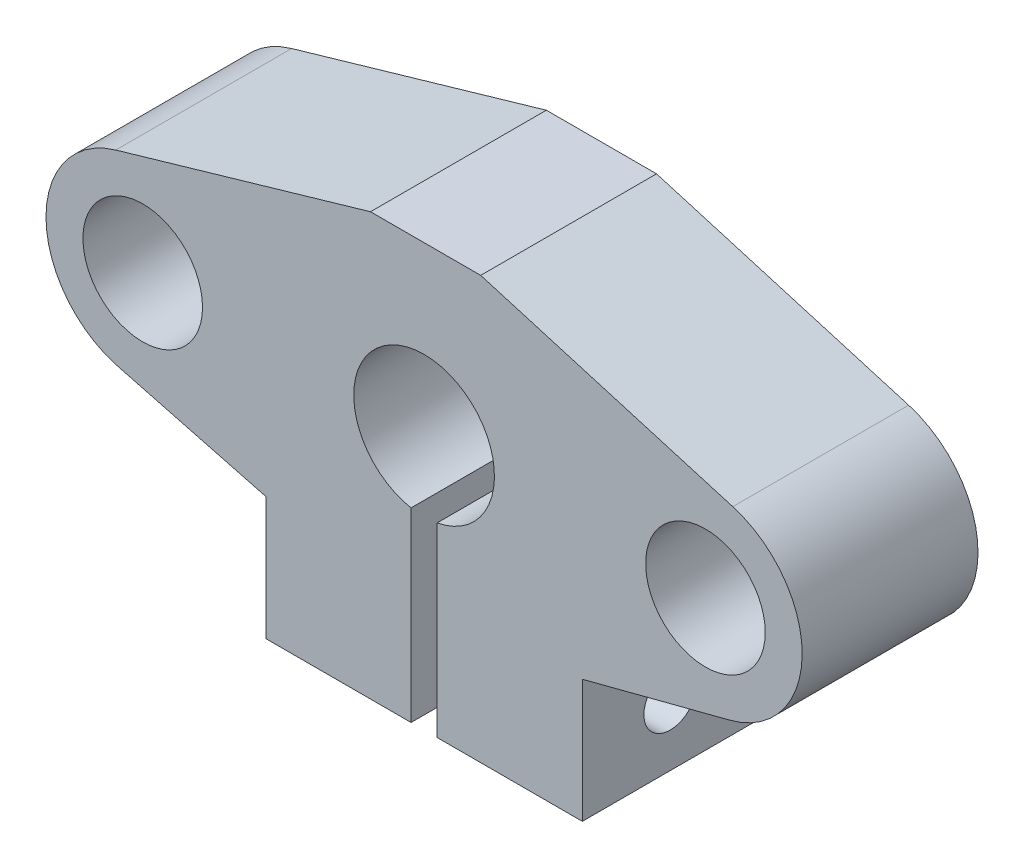
ISO-10303-21;
HEADER;
FILE_DESCRIPTION(('STEP AP214'),'2;1');
FILE_NAME('part.step','',(''),(''),'','','');
FILE_SCHEMA(('AUTOMOTIVE_DESIGN { 1 0 10303 214 1 1 1 1 }'));
ENDSEC;
DATA;
#1=APPLICATION_CONTEXT('core data for automotive mechanical design processes');
#2=APPLICATION_PROTOCOL_DEFINITION('international standard','automotive_design',2000,#1);
#3=PRODUCT_CONTEXT('',#1,'mechanical');
#4=PRODUCT('Part','Part','',(#3));
#5=PRODUCT_RELATED_PRODUCT_CATEGORY('part','',(#4));
#6=PRODUCT_DEFINITION_FORMATION('','',#4);
#7=PRODUCT_DEFINITION_CONTEXT('part definition',#1,'design');
#8=PRODUCT_DEFINITION('design','',#6,#7);
#9=PRODUCT_DEFINITION_SHAPE('','',#8);
#10=(LENGTH_UNIT() NAMED_UNIT(*) SI_UNIT(.MILLI.,.METRE.));
#11=(NAMED_UNIT(*) PLANE_ANGLE_UNIT() SI_UNIT($,.RADIAN.));
#12=(NAMED_UNIT(*) SI_UNIT($,.STERADIAN.) SOLID_ANGLE_UNIT());
#13=UNCERTAINTY_MEASURE_WITH_UNIT(LENGTH_MEASURE(1.E-05),#10,'distance_accuracy_value','');
#14=(GEOMETRIC_REPRESENTATION_CONTEXT(3) GLOBAL_UNCERTAINTY_ASSIGNED_CONTEXT((#13)) GLOBAL_UNIT_ASSIGNED_CONTEXT((#10,
#11,#12)) REPRESENTATION_CONTEXT('',''));
#15=CARTESIAN_POINT('',(0.,0.,0.));
#16=DIRECTION('',(0.,0.,1.));
#17=DIRECTION('',(1.,0.,0.));
#18=AXIS2_PLACEMENT_3D('',#15,#16,#17);
#19=CARTESIAN_POINT('',(0.,0.,10.));
#20=DIRECTION('',(0.,0.,1.));
#21=DIRECTION('',(1.,0.,0.));
#22=AXIS2_PLACEMENT_3D('',#19,#20,#21);
#23=PLANE('',#22);
#24=CARTESIAN_POINT('',(-15.9999942904647,0.0135168449332014,10.));
#25=DIRECTION('',(0.,0.,1.));
#26=DIRECTION('',(1.,0.,0.));
#27=AXIS2_PLACEMENT_3D('',#24,#25,#26);
#28=CIRCLE('',#27,3.4);
#29=CARTESIAN_POINT('',(-12.5999942904647,0.0135168449332014,10.));
#30=VERTEX_POINT('',#29);
#31=EDGE_CURVE('E172',#30,#30,#28,.T.);
#32=ORIENTED_EDGE('',*,*,#31,.F.);
#33=EDGE_LOOP('',(#32));
#34=FACE_BOUND('',#33,.T.);
#35=CARTESIAN_POINT('',(0.,0.,10.));
#36=DIRECTION('',(0.,0.,-1.));
#37=DIRECTION('',(1.,0.,0.));
#38=AXIS2_PLACEMENT_3D('',#35,#36,#37);
#39=CIRCLE('',#38,4.);
#40=CARTESIAN_POINT('',(-0.740403032800426,-3.93087819055996,10.));
#41=VERTEX_POINT('',#40);
#42=CARTESIAN_POINT('',(0.74040303280043,-3.93087819055996,10.));
#43=VERTEX_POINT('',#42);
#44=EDGE_CURVE('E195',#41,#43,#39,.T.);
#45=ORIENTED_EDGE('',*,*,#44,.T.);
#46=DIRECTION('',(0.,-1.,0.));
#47=VECTOR('',#46,1.);
#48=CARTESIAN_POINT('',(0.74040303280043,-14.5,10.));
#49=LINE('',#48,#47);
#50=CARTESIAN_POINT('',(0.74040303280043,-14.5,10.));
#51=VERTEX_POINT('',#50);
#52=EDGE_CURVE('E113',#43,#51,#49,.T.);
#53=ORIENTED_EDGE('',*,*,#52,.T.);
#54=DIRECTION('',(1.,0.,0.));
#55=VECTOR('',#54,1.);
#56=CARTESIAN_POINT('',(0.74040303280043,-14.5,10.));
#57=LINE('',#56,#55);
#58=CARTESIAN_POINT('',(9.,-14.5,10.));
#59=VERTEX_POINT('',#58);
#60=EDGE_CURVE('E229',#51,#59,#57,.T.);
#61=ORIENTED_EDGE('',*,*,#60,.T.);
#62=DIRECTION('',(0.,1.,0.));
#63=VECTOR('',#62,1.);
#64=CARTESIAN_POINT('',(8.99999999999999,-7.5,10.));
#65=LINE('',#64,#63);
#66=CARTESIAN_POINT('',(8.99999999999999,-7.5,10.));
#67=VERTEX_POINT('',#66);
#68=EDGE_CURVE('E248',#59,#67,#65,.T.);
#69=ORIENTED_EDGE('',*,*,#68,.T.);
#70=DIRECTION('',(0.967891878530005,0.251366886195574,0.));
#71=VECTOR('',#70,1.);
#72=CARTESIAN_POINT('',(8.99999999999999,-7.5,10.));
#73=LINE('',#72,#71);
#74=CARTESIAN_POINT('',(17.3824225772709,-5.32303839017206,10.));
#75=VERTEX_POINT('',#74);
#76=EDGE_CURVE('E245',#67,#75,#73,.T.);
#77=ORIENTED_EDGE('',*,*,#76,.T.);
#78=CARTESIAN_POINT('',(16.,0.,10.));
#79=DIRECTION('',(0.,0.,1.));
#80=DIRECTION('',(1.,0.,0.));
#81=AXIS2_PLACEMENT_3D('',#78,#79,#80);
#82=CIRCLE('',#81,5.49962088560602);
#83=CARTESIAN_POINT('',(17.5546840026287,5.27529975805777,10.));
#84=VERTEX_POINT('',#83);
#85=EDGE_CURVE('E247',#75,#84,#82,.T.);
#86=ORIENTED_EDGE('',*,*,#85,.T.);
#87=DIRECTION('',(-0.959211528900954,0.282689304402366,0.));
#88=VECTOR('',#87,1.);
#89=CARTESIAN_POINT('',(3.2195778804187,9.5,10.));
#90=LINE('',#89,#88);
#91=CARTESIAN_POINT('',(3.2195778804187,9.5,10.));
#92=VERTEX_POINT('',#91);
#93=EDGE_CURVE('E250',#84,#92,#90,.T.);
#94=ORIENTED_EDGE('',*,*,#93,.T.);
#95=DIRECTION('',(-1.,0.,0.));
#96=VECTOR('',#95,1.);
#97=CARTESIAN_POINT('',(-3.04677229171448,9.5,10.));
#98=LINE('',#97,#96);
#99=CARTESIAN_POINT('',(-3.04677229171448,9.5,10.));
#100=VERTEX_POINT('',#99);
#101=EDGE_CURVE('E256',#92,#100,#98,.T.);
#102=ORIENTED_EDGE('',*,*,#101,.T.);
#103=DIRECTION('',(-0.960368072137898,-0.27873493863909,0.));
#104=VECTOR('',#103,1.);
#105=CARTESIAN_POINT('',(-3.04677229171448,9.5,10.));
#106=LINE('',#105,#104);
#107=CARTESIAN_POINT('',(-17.5330364529797,5.29554124169164,10.));
#108=VERTEX_POINT('',#107);
#109=EDGE_CURVE('E258',#100,#108,#106,.T.);
#110=ORIENTED_EDGE('',*,*,#109,.T.);
#111=CARTESIAN_POINT('',(-15.9999942904647,0.0135168449332014,10.));
#112=DIRECTION('',(0.,0.,1.));
#113=DIRECTION('',(1.,0.,0.));
#114=AXIS2_PLACEMENT_3D('',#111,#112,#113);
#115=CIRCLE('',#114,5.5);
#116=CARTESIAN_POINT('',(-17.5974469522091,-5.2493858706303,10.));
#117=VERTEX_POINT('',#116);
#118=EDGE_CURVE('E260',#108,#117,#115,.T.);
#119=ORIENTED_EDGE('',*,*,#118,.T.);
#120=DIRECTION('',(0.967402502123384,-0.253243753892204,0.));
#121=VECTOR('',#120,1.);
#122=CARTESIAN_POINT('',(-9.00000000000001,-7.50000000000004,10.));
#123=LINE('',#122,#121);
#124=CARTESIAN_POINT('',(-9.00000000000001,-7.50000000000004,10.));
#125=VERTEX_POINT('',#124);
#126=EDGE_CURVE('E150',#117,#125,#123,.T.);
#127=ORIENTED_EDGE('',*,*,#126,.T.);
#128=DIRECTION('',(0.,-1.,0.));
#129=VECTOR('',#128,1.);
#130=CARTESIAN_POINT('',(-9.00000000000001,-7.50000000000004,10.));
#131=LINE('',#130,#129);
#132=CARTESIAN_POINT('',(-9.00000000000001,-14.5,10.));
#133=VERTEX_POINT('',#132);
#134=EDGE_CURVE('E144',#125,#133,#131,.T.);
#135=ORIENTED_EDGE('',*,*,#134,.T.);
#136=DIRECTION('',(1.,0.,0.));
#137=VECTOR('',#136,1.);
#138=CARTESIAN_POINT('',(-9.00000000000001,-14.5,10.));
#139=LINE('',#138,#137);
#140=CARTESIAN_POINT('',(-0.740403032800426,-14.5,10.));
#141=VERTEX_POINT('',#140);
#142=EDGE_CURVE('E148',#133,#141,#139,.T.);
#143=ORIENTED_EDGE('',*,*,#142,.T.);
#144=DIRECTION('',(0.,1.,0.));
#145=VECTOR('',#144,1.);
#146=CARTESIAN_POINT('',(-0.740403032800426,-14.5,10.));
#147=LINE('',#146,#145);
#148=EDGE_CURVE('E52',#141,#41,#147,.T.);
#149=ORIENTED_EDGE('',*,*,#148,.T.);
#150=EDGE_LOOP('',(#45,#53,#61,#69,#77,#86,#94,#102,#110,#119,#127,#135,#143,#149));
#151=FACE_BOUND('',#150,.T.);
#152=CARTESIAN_POINT('',(16.,0.,10.));
#153=DIRECTION('',(0.,0.,1.));
#154=DIRECTION('',(1.,0.,0.));
#155=AXIS2_PLACEMENT_3D('',#152,#153,#154);
#156=CIRCLE('',#155,3.4);
#157=CARTESIAN_POINT('',(19.4,0.,10.));
#158=VERTEX_POINT('',#157);
#159=EDGE_CURVE('E319',#158,#158,#156,.T.);
#160=ORIENTED_EDGE('',*,*,#159,.F.);
#161=EDGE_LOOP('',(#160));
#162=FACE_BOUND('',#161,.T.);
#163=ADVANCED_FACE('F34',(#34,#151,#162),#23,.T.);
#164=CARTESIAN_POINT('',(0.,0.,0.));
#165=DIRECTION('',(0.,0.,1.));
#166=DIRECTION('',(1.,0.,0.));
#167=AXIS2_PLACEMENT_3D('',#164,#165,#166);
#168=PLANE('',#167);
#169=CARTESIAN_POINT('',(0.,0.,0.));
#170=DIRECTION('',(0.,0.,-1.));
#171=DIRECTION('',(1.,0.,0.));
#172=AXIS2_PLACEMENT_3D('',#169,#170,#171);
#173=CIRCLE('',#172,4.);
#174=CARTESIAN_POINT('',(-0.740403032800426,-3.93087819055996,0.));
#175=VERTEX_POINT('',#174);
#176=CARTESIAN_POINT('',(0.74040303280043,-3.93087819055996,0.));
#177=VERTEX_POINT('',#176);
#178=EDGE_CURVE('E168',#175,#177,#173,.T.);
#179=ORIENTED_EDGE('',*,*,#178,.F.);
#180=DIRECTION('',(0.,1.,0.));
#181=VECTOR('',#180,1.);
#182=CARTESIAN_POINT('',(-0.740403032800426,-14.5,0.));
#183=LINE('',#182,#181);
#184=CARTESIAN_POINT('',(-0.740403032800426,-14.5,0.));
#185=VERTEX_POINT('',#184);
#186=EDGE_CURVE('E105',#185,#175,#183,.T.);
#187=ORIENTED_EDGE('',*,*,#186,.F.);
#188=DIRECTION('',(1.,0.,0.));
#189=VECTOR('',#188,1.);
#190=CARTESIAN_POINT('',(-9.00000000000001,-14.5,0.));
#191=LINE('',#190,#189);
#192=CARTESIAN_POINT('',(-9.00000000000001,-14.5,0.));
#193=VERTEX_POINT('',#192);
#194=EDGE_CURVE('E99',#193,#185,#191,.T.);
#195=ORIENTED_EDGE('',*,*,#194,.F.);
#196=DIRECTION('',(0.,-1.,0.));
#197=VECTOR('',#196,1.);
#198=CARTESIAN_POINT('',(-9.00000000000001,-7.50000000000004,0.));
#199=LINE('',#198,#197);
#200=CARTESIAN_POINT('',(-9.00000000000001,-7.50000000000004,0.));
#201=VERTEX_POINT('',#200);
#202=EDGE_CURVE('E158',#201,#193,#199,.T.);
#203=ORIENTED_EDGE('',*,*,#202,.F.);
#204=DIRECTION('',(0.967402502123384,-0.253243753892204,0.));
#205=VECTOR('',#204,1.);
#206=CARTESIAN_POINT('',(-9.00000000000001,-7.50000000000004,0.));
#207=LINE('',#206,#205);
#208=CARTESIAN_POINT('',(-17.5974469522091,-5.2493858706303,0.));
#209=VERTEX_POINT('',#208);
#210=EDGE_CURVE('E190',#209,#201,#207,.T.);
#211=ORIENTED_EDGE('',*,*,#210,.F.);
#212=CARTESIAN_POINT('',(-15.9999942904647,0.0135168449332014,0.));
#213=DIRECTION('',(0.,0.,1.));
#214=DIRECTION('',(1.,0.,0.));
#215=AXIS2_PLACEMENT_3D('',#212,#213,#214);
#216=CIRCLE('',#215,5.5);
#217=CARTESIAN_POINT('',(-17.5330364529797,5.29554124169164,0.));
#218=VERTEX_POINT('',#217);
#219=EDGE_CURVE('E188',#218,#209,#216,.T.);
#220=ORIENTED_EDGE('',*,*,#219,.F.);
#221=DIRECTION('',(-0.960368072137898,-0.27873493863909,0.));
#222=VECTOR('',#221,1.);
#223=CARTESIAN_POINT('',(-3.04677229171448,9.5,0.));
#224=LINE('',#223,#222);
#225=CARTESIAN_POINT('',(-3.04677229171448,9.5,0.));
#226=VERTEX_POINT('',#225);
#227=EDGE_CURVE('E186',#226,#218,#224,.T.);
#228=ORIENTED_EDGE('',*,*,#227,.F.);
#229=DIRECTION('',(-1.,0.,0.));
#230=VECTOR('',#229,1.);
#231=CARTESIAN_POINT('',(-3.04677229171448,9.5,0.));
#232=LINE('',#231,#230);
#233=CARTESIAN_POINT('',(3.2195778804187,9.5,0.));
#234=VERTEX_POINT('',#233);
#235=EDGE_CURVE('E184',#234,#226,#232,.T.);
#236=ORIENTED_EDGE('',*,*,#235,.F.);
#237=DIRECTION('',(-0.959211528900954,0.282689304402366,0.));
#238=VECTOR('',#237,1.);
#239=CARTESIAN_POINT('',(3.2195778804187,9.5,0.));
#240=LINE('',#239,#238);
#241=CARTESIAN_POINT('',(17.5546840026287,5.27529975805777,0.));
#242=VERTEX_POINT('',#241);
#243=EDGE_CURVE('E182',#242,#234,#240,.T.);
#244=ORIENTED_EDGE('',*,*,#243,.F.);
#245=CARTESIAN_POINT('',(16.,0.,0.));
#246=DIRECTION('',(0.,0.,1.));
#247=DIRECTION('',(1.,0.,0.));
#248=AXIS2_PLACEMENT_3D('',#245,#246,#247);
#249=CIRCLE('',#248,5.49962088560602);
#250=CARTESIAN_POINT('',(17.3824225772709,-5.32303839017206,0.));
#251=VERTEX_POINT('',#250);
#252=EDGE_CURVE('E180',#251,#242,#249,.T.);
#253=ORIENTED_EDGE('',*,*,#252,.F.);
#254=DIRECTION('',(0.967891878530005,0.251366886195574,0.));
#255=VECTOR('',#254,1.);
#256=CARTESIAN_POINT('',(8.99999999999999,-7.5,0.));
#257=LINE('',#256,#255);
#258=CARTESIAN_POINT('',(8.99999999999999,-7.5,0.));
#259=VERTEX_POINT('',#258);
#260=EDGE_CURVE('E178',#259,#251,#257,.T.);
#261=ORIENTED_EDGE('',*,*,#260,.F.);
#262=DIRECTION('',(0.,1.,0.));
#263=VECTOR('',#262,1.);
#264=CARTESIAN_POINT('',(8.99999999999999,-7.5,0.));
#265=LINE('',#264,#263);
#266=CARTESIAN_POINT('',(9.,-14.5,0.));
#267=VERTEX_POINT('',#266);
#268=EDGE_CURVE('E176',#267,#259,#265,.T.);
#269=ORIENTED_EDGE('',*,*,#268,.F.);
#270=DIRECTION('',(1.,0.,0.));
#271=VECTOR('',#270,1.);
#272=CARTESIAN_POINT('',(0.74040303280043,-14.5,0.));
#273=LINE('',#272,#271);
#274=CARTESIAN_POINT('',(0.74040303280043,-14.5,0.));
#275=VERTEX_POINT('',#274);
#276=EDGE_CURVE('E174',#275,#267,#273,.T.);
#277=ORIENTED_EDGE('',*,*,#276,.F.);
#278=DIRECTION('',(0.,-1.,0.));
#279=VECTOR('',#278,1.);
#280=CARTESIAN_POINT('',(0.74040303280043,-14.5,0.));
#281=LINE('',#280,#279);
#282=EDGE_CURVE('E171',#177,#275,#281,.T.);
#283=ORIENTED_EDGE('',*,*,#282,.F.);
#284=EDGE_LOOP('',(#179,#187,#195,#203,#211,#220,#228,#236,#244,#253,#261,#269,#277,#283));
#285=FACE_BOUND('',#284,.T.);
#286=CARTESIAN_POINT('',(-15.9999942904647,0.0135168449332014,0.));
#287=DIRECTION('',(0.,0.,1.));
#288=DIRECTION('',(1.,0.,0.));
#289=AXIS2_PLACEMENT_3D('',#286,#287,#288);
#290=CIRCLE('',#289,3.4);
#291=CARTESIAN_POINT('',(-12.5999942904647,0.0135168449332014,0.));
#292=VERTEX_POINT('',#291);
#293=EDGE_CURVE('E325',#292,#292,#290,.T.);
#294=ORIENTED_EDGE('',*,*,#293,.T.);
#295=EDGE_LOOP('',(#294));
#296=FACE_BOUND('',#295,.T.);
#297=CARTESIAN_POINT('',(16.,0.,0.));
#298=DIRECTION('',(0.,0.,1.));
#299=DIRECTION('',(1.,0.,0.));
#300=AXIS2_PLACEMENT_3D('',#297,#298,#299);
#301=CIRCLE('',#300,3.4);
#302=CARTESIAN_POINT('',(19.4,0.,0.));
#303=VERTEX_POINT('',#302);
#304=EDGE_CURVE('E316',#303,#303,#301,.T.);
#305=ORIENTED_EDGE('',*,*,#304,.T.);
#306=EDGE_LOOP('',(#305));
#307=FACE_BOUND('',#306,.T.);
#308=ADVANCED_FACE('F233',(#285,#296,#307),#168,.F.);
#309=CARTESIAN_POINT('',(0.,0.,10.));
#310=DIRECTION('',(0.,0.,-1.));
#311=DIRECTION('',(-1.,0.,0.));
#312=AXIS2_PLACEMENT_3D('',#309,#310,#311);
#313=CYLINDRICAL_SURFACE('',#312,4.);
#314=ORIENTED_EDGE('',*,*,#178,.T.);
#315=DIRECTION('',(0.,0.,-1.));
#316=VECTOR('',#315,1.);
#317=CARTESIAN_POINT('',(0.74040303280043,-3.93087819055996,10.));
#318=LINE('',#317,#316);
#319=EDGE_CURVE('E11',#43,#177,#318,.T.);
#320=ORIENTED_EDGE('',*,*,#319,.F.);
#321=ORIENTED_EDGE('',*,*,#44,.F.);
#322=DIRECTION('',(0.,0.,-1.));
#323=VECTOR('',#322,1.);
#324=CARTESIAN_POINT('',(-0.740403032800426,-3.93087819055996,10.));
#325=LINE('',#324,#323);
#326=EDGE_CURVE('E164',#41,#175,#325,.T.);
#327=ORIENTED_EDGE('',*,*,#326,.T.);
#328=EDGE_LOOP('',(#314,#320,#321,#327));
#329=FACE_BOUND('',#328,.T.);
#330=ADVANCED_FACE('F36',(#329),#313,.F.);
#331=CARTESIAN_POINT('',(0.74040303280043,-14.5,10.));
#332=DIRECTION('',(1.,0.,0.));
#333=DIRECTION('',(0.,0.,-1.));
#334=AXIS2_PLACEMENT_3D('',#331,#332,#333);
#335=PLANE('',#334);
#336=CARTESIAN_POINT('',(0.74040303280043,-11.,5.));
#337=DIRECTION('',(1.,0.,0.));
#338=DIRECTION('',(0.,0.,-1.));
#339=AXIS2_PLACEMENT_3D('',#336,#337,#338);
#340=CIRCLE('',#339,1.5);
#341=CARTESIAN_POINT('',(0.74040303280043,-11.,3.5));
#342=VERTEX_POINT('',#341);
#343=EDGE_CURVE('E314',#342,#342,#340,.T.);
#344=ORIENTED_EDGE('',*,*,#343,.T.);
#345=EDGE_LOOP('',(#344));
#346=FACE_BOUND('',#345,.T.);
#347=ORIENTED_EDGE('',*,*,#282,.T.);
#348=DIRECTION('',(0.,0.,-1.));
#349=VECTOR('',#348,1.);
#350=CARTESIAN_POINT('',(0.74040303280043,-14.5,10.));
#351=LINE('',#350,#349);
#352=EDGE_CURVE('E44',#51,#275,#351,.T.);
#353=ORIENTED_EDGE('',*,*,#352,.F.);
#354=ORIENTED_EDGE('',*,*,#52,.F.);
#355=ORIENTED_EDGE('',*,*,#319,.T.);
#356=EDGE_LOOP('',(#347,#353,#354,#355));
#357=FACE_BOUND('',#356,.T.);
#358=ADVANCED_FACE('F375',(#346,#357),#335,.F.);
#359=CARTESIAN_POINT('',(0.74040303280043,-14.5,10.));
#360=DIRECTION('',(0.,1.,0.));
#361=DIRECTION('',(0.,0.,1.));
#362=AXIS2_PLACEMENT_3D('',#359,#360,#361);
#363=PLANE('',#362);
#364=ORIENTED_EDGE('',*,*,#276,.T.);
#365=DIRECTION('',(0.,0.,-1.));
#366=VECTOR('',#365,1.);
#367=CARTESIAN_POINT('',(9.,-14.5,10.));
#368=LINE('',#367,#366);
#369=EDGE_CURVE('E220',#59,#267,#368,.T.);
#370=ORIENTED_EDGE('',*,*,#369,.F.);
#371=ORIENTED_EDGE('',*,*,#60,.F.);
#372=ORIENTED_EDGE('',*,*,#352,.T.);
#373=EDGE_LOOP('',(#364,#370,#371,#372));
#374=FACE_BOUND('',#373,.T.);
#375=ADVANCED_FACE('F227',(#374),#363,.F.);
#376=CARTESIAN_POINT('',(8.99999999999999,-7.5,10.));
#377=DIRECTION('',(-1.,0.,0.));
#378=DIRECTION('',(0.,-1.,0.));
#379=AXIS2_PLACEMENT_3D('',#376,#377,#378);
#380=PLANE('',#379);
#381=CARTESIAN_POINT('',(9.,-11.,5.));
#382=DIRECTION('',(-1.,0.,0.));
#383=DIRECTION('',(0.,-1.,0.));
#384=AXIS2_PLACEMENT_3D('',#381,#382,#383);
#385=CIRCLE('',#384,1.5);
#386=CARTESIAN_POINT('',(9.,-12.5,5.));
#387=VERTEX_POINT('',#386);
#388=EDGE_CURVE('E311',#387,#387,#385,.T.);
#389=ORIENTED_EDGE('',*,*,#388,.T.);
#390=EDGE_LOOP('',(#389));
#391=FACE_BOUND('',#390,.T.);
#392=ORIENTED_EDGE('',*,*,#268,.T.);
#393=DIRECTION('',(0.,0.,-1.));
#394=VECTOR('',#393,1.);
#395=CARTESIAN_POINT('',(8.99999999999999,-7.5,10.));
#396=LINE('',#395,#394);
#397=EDGE_CURVE('E217',#67,#259,#396,.T.);
#398=ORIENTED_EDGE('',*,*,#397,.F.);
#399=ORIENTED_EDGE('',*,*,#68,.F.);
#400=ORIENTED_EDGE('',*,*,#369,.T.);
#401=EDGE_LOOP('',(#392,#398,#399,#400));
#402=FACE_BOUND('',#401,.T.);
#403=ADVANCED_FACE('F239',(#391,#402),#380,.F.);
#404=CARTESIAN_POINT('',(8.99999999999999,-7.5,10.));
#405=DIRECTION('',(-0.251366886195574,0.967891878530005,0.));
#406=DIRECTION('',(-0.967891878530005,-0.251366886195574,0.));
#407=AXIS2_PLACEMENT_3D('',#404,#405,#406);
#408=PLANE('',#407);
#409=ORIENTED_EDGE('',*,*,#260,.T.);
#410=DIRECTION('',(0.,0.,-1.));
#411=VECTOR('',#410,1.);
#412=CARTESIAN_POINT('',(17.3824225772709,-5.32303839017206,10.));
#413=LINE('',#412,#411);
#414=EDGE_CURVE('E214',#75,#251,#413,.T.);
#415=ORIENTED_EDGE('',*,*,#414,.F.);
#416=ORIENTED_EDGE('',*,*,#76,.F.);
#417=ORIENTED_EDGE('',*,*,#397,.T.);
#418=EDGE_LOOP('',(#409,#415,#416,#417));
#419=FACE_BOUND('',#418,.T.);
#420=ADVANCED_FACE('F243',(#419),#408,.F.);
#421=CARTESIAN_POINT('',(16.,0.,10.));
#422=DIRECTION('',(0.,0.,-1.));
#423=DIRECTION('',(-1.,0.,0.));
#424=AXIS2_PLACEMENT_3D('',#421,#422,#423);
#425=CYLINDRICAL_SURFACE('',#424,5.49962088560602);
#426=ORIENTED_EDGE('',*,*,#252,.T.);
#427=DIRECTION('',(0.,0.,-1.));
#428=VECTOR('',#427,1.);
#429=CARTESIAN_POINT('',(17.5546840026287,5.27529975805777,10.));
#430=LINE('',#429,#428);
#431=EDGE_CURVE('E211',#84,#242,#430,.T.);
#432=ORIENTED_EDGE('',*,*,#431,.F.);
#433=ORIENTED_EDGE('',*,*,#85,.F.);
#434=ORIENTED_EDGE('',*,*,#414,.T.);
#435=EDGE_LOOP('',(#426,#432,#433,#434));
#436=FACE_BOUND('',#435,.T.);
#437=ADVANCED_FACE('F364',(#436),#425,.T.);
#438=CARTESIAN_POINT('',(3.2195778804187,9.5,10.));
#439=DIRECTION('',(-0.282689304402366,-0.959211528900954,0.));
#440=DIRECTION('',(0.959211528900954,-0.282689304402366,0.));
#441=AXIS2_PLACEMENT_3D('',#438,#439,#440);
#442=PLANE('',#441);
#443=ORIENTED_EDGE('',*,*,#243,.T.);
#444=DIRECTION('',(0.,0.,-1.));
#445=VECTOR('',#444,1.);
#446=CARTESIAN_POINT('',(3.2195778804187,9.5,10.));
#447=LINE('',#446,#445);
#448=EDGE_CURVE('E208',#92,#234,#447,.T.);
#449=ORIENTED_EDGE('',*,*,#448,.F.);
#450=ORIENTED_EDGE('',*,*,#93,.F.);
#451=ORIENTED_EDGE('',*,*,#431,.T.);
#452=EDGE_LOOP('',(#443,#449,#450,#451));
#453=FACE_BOUND('',#452,.T.);
#454=ADVANCED_FACE('F360',(#453),#442,.F.);
#455=CARTESIAN_POINT('',(-3.04677229171448,9.5,10.));
#456=DIRECTION('',(0.,-1.,0.));
#457=DIRECTION('',(0.,0.,-1.));
#458=AXIS2_PLACEMENT_3D('',#455,#456,#457);
#459=PLANE('',#458);
#460=ORIENTED_EDGE('',*,*,#235,.T.);
#461=DIRECTION('',(0.,0.,-1.));
#462=VECTOR('',#461,1.);
#463=CARTESIAN_POINT('',(-3.04677229171448,9.5,10.));
#464=LINE('',#463,#462);
#465=EDGE_CURVE('E205',#100,#226,#464,.T.);
#466=ORIENTED_EDGE('',*,*,#465,.F.);
#467=ORIENTED_EDGE('',*,*,#101,.F.);
#468=ORIENTED_EDGE('',*,*,#448,.T.);
#469=EDGE_LOOP('',(#460,#466,#467,#468));
#470=FACE_BOUND('',#469,.T.);
#471=ADVANCED_FACE('F356',(#470),#459,.F.);
#472=CARTESIAN_POINT('',(-3.04677229171448,9.5,10.));
#473=DIRECTION('',(0.27873493863909,-0.960368072137898,0.));
#474=DIRECTION('',(0.960368072137898,0.27873493863909,0.));
#475=AXIS2_PLACEMENT_3D('',#472,#473,#474);
#476=PLANE('',#475);
#477=ORIENTED_EDGE('',*,*,#227,.T.);
#478=DIRECTION('',(0.,0.,-1.));
#479=VECTOR('',#478,1.);
#480=CARTESIAN_POINT('',(-17.5330364529797,5.29554124169164,10.));
#481=LINE('',#480,#479);
#482=EDGE_CURVE('E202',#108,#218,#481,.T.);
#483=ORIENTED_EDGE('',*,*,#482,.F.);
#484=ORIENTED_EDGE('',*,*,#109,.F.);
#485=ORIENTED_EDGE('',*,*,#465,.T.);
#486=EDGE_LOOP('',(#477,#483,#484,#485));
#487=FACE_BOUND('',#486,.T.);
#488=ADVANCED_FACE('F353',(#487),#476,.F.);
#489=CARTESIAN_POINT('',(-15.9999942904647,0.0135168449332014,10.));
#490=DIRECTION('',(0.,0.,-1.));
#491=DIRECTION('',(-1.,0.,0.));
#492=AXIS2_PLACEMENT_3D('',#489,#490,#491);
#493=CYLINDRICAL_SURFACE('',#492,5.5);
#494=ORIENTED_EDGE('',*,*,#219,.T.);
#495=DIRECTION('',(0.,0.,-1.));
#496=VECTOR('',#495,1.);
#497=CARTESIAN_POINT('',(-17.5974469522091,-5.2493858706303,10.));
#498=LINE('',#497,#496);
#499=EDGE_CURVE('E199',#117,#209,#498,.T.);
#500=ORIENTED_EDGE('',*,*,#499,.F.);
#501=ORIENTED_EDGE('',*,*,#118,.F.);
#502=ORIENTED_EDGE('',*,*,#482,.T.);
#503=EDGE_LOOP('',(#494,#500,#501,#502));
#504=FACE_BOUND('',#503,.T.);
#505=ADVANCED_FACE('F266',(#504),#493,.T.);
#506=CARTESIAN_POINT('',(-9.00000000000001,-7.50000000000004,10.));
#507=DIRECTION('',(0.253243753892204,0.967402502123385,0.));
#508=DIRECTION('',(-0.967402502123385,0.253243753892204,0.));
#509=AXIS2_PLACEMENT_3D('',#506,#507,#508);
#510=PLANE('',#509);
#511=ORIENTED_EDGE('',*,*,#210,.T.);
#512=DIRECTION('',(0.,0.,-1.));
#513=VECTOR('',#512,1.);
#514=CARTESIAN_POINT('',(-9.00000000000001,-7.50000000000004,10.));
#515=LINE('',#514,#513);
#516=EDGE_CURVE('E159',#125,#201,#515,.T.);
#517=ORIENTED_EDGE('',*,*,#516,.F.);
#518=ORIENTED_EDGE('',*,*,#126,.F.);
#519=ORIENTED_EDGE('',*,*,#499,.T.);
#520=EDGE_LOOP('',(#511,#517,#518,#519));
#521=FACE_BOUND('',#520,.T.);
#522=ADVANCED_FACE('F270',(#521),#510,.F.);
#523=CARTESIAN_POINT('',(-9.00000000000001,-7.50000000000004,10.));
#524=DIRECTION('',(1.,0.,0.));
#525=DIRECTION('',(0.,0.,-1.));
#526=AXIS2_PLACEMENT_3D('',#523,#524,#525);
#527=PLANE('',#526);
#528=CARTESIAN_POINT('',(-9.00000000000001,-11.,5.));
#529=DIRECTION('',(-1.,0.,0.));
#530=DIRECTION('',(0.,0.,1.));
#531=AXIS2_PLACEMENT_3D('',#528,#529,#530);
#532=CIRCLE('',#531,1.5);
#533=CARTESIAN_POINT('',(-9.00000000000001,-11.,6.5));
#534=VERTEX_POINT('',#533);
#535=EDGE_CURVE('E338',#534,#534,#532,.T.);
#536=ORIENTED_EDGE('',*,*,#535,.F.);
#537=EDGE_LOOP('',(#536));
#538=FACE_BOUND('',#537,.T.);
#539=ORIENTED_EDGE('',*,*,#202,.T.);
#540=DIRECTION('',(0.,0.,-1.));
#541=VECTOR('',#540,1.);
#542=CARTESIAN_POINT('',(-9.00000000000001,-14.5,10.));
#543=LINE('',#542,#541);
#544=EDGE_CURVE('E155',#133,#193,#543,.T.);
#545=ORIENTED_EDGE('',*,*,#544,.F.);
#546=ORIENTED_EDGE('',*,*,#134,.F.);
#547=ORIENTED_EDGE('',*,*,#516,.T.);
#548=EDGE_LOOP('',(#539,#545,#546,#547));
#549=FACE_BOUND('',#548,.T.);
#550=ADVANCED_FACE('F156',(#538,#549),#527,.F.);
#551=CARTESIAN_POINT('',(-9.00000000000001,-14.5,10.));
#552=DIRECTION('',(0.,1.,0.));
#553=DIRECTION('',(-1.,0.,0.));
#554=AXIS2_PLACEMENT_3D('',#551,#552,#553);
#555=PLANE('',#554);
#556=ORIENTED_EDGE('',*,*,#194,.T.);
#557=DIRECTION('',(0.,0.,-1.));
#558=VECTOR('',#557,1.);
#559=CARTESIAN_POINT('',(-0.740403032800426,-14.5,10.));
#560=LINE('',#559,#558);
#561=EDGE_CURVE('E160',#141,#185,#560,.T.);
#562=ORIENTED_EDGE('',*,*,#561,.F.);
#563=ORIENTED_EDGE('',*,*,#142,.F.);
#564=ORIENTED_EDGE('',*,*,#544,.T.);
#565=EDGE_LOOP('',(#556,#562,#563,#564));
#566=FACE_BOUND('',#565,.T.);
#567=ADVANCED_FACE('F162',(#566),#555,.F.);
#568=CARTESIAN_POINT('',(-0.740403032800426,-14.5,10.));
#569=DIRECTION('',(-1.,0.,0.));
#570=DIRECTION('',(0.,0.,1.));
#571=AXIS2_PLACEMENT_3D('',#568,#569,#570);
#572=PLANE('',#571);
#573=CARTESIAN_POINT('',(-0.740403032800426,-11.,5.));
#574=DIRECTION('',(-1.,0.,0.));
#575=DIRECTION('',(0.,0.,1.));
#576=AXIS2_PLACEMENT_3D('',#573,#574,#575);
#577=CIRCLE('',#576,1.5);
#578=CARTESIAN_POINT('',(-0.740403032800426,-11.,6.5));
#579=VERTEX_POINT('',#578);
#580=EDGE_CURVE('E38',#579,#579,#577,.T.);
#581=ORIENTED_EDGE('',*,*,#580,.T.);
#582=EDGE_LOOP('',(#581));
#583=FACE_BOUND('',#582,.T.);
#584=ORIENTED_EDGE('',*,*,#186,.T.);
#585=ORIENTED_EDGE('',*,*,#326,.F.);
#586=ORIENTED_EDGE('',*,*,#148,.F.);
#587=ORIENTED_EDGE('',*,*,#561,.T.);
#588=EDGE_LOOP('',(#584,#585,#586,#587));
#589=FACE_BOUND('',#588,.T.);
#590=ADVANCED_FACE('F274',(#583,#589),#572,.F.);
#591=CARTESIAN_POINT('',(-15.9999942904647,0.0135168449332014,10.));
#592=DIRECTION('',(0.,0.,-1.));
#593=DIRECTION('',(-1.,0.,0.));
#594=AXIS2_PLACEMENT_3D('',#591,#592,#593);
#595=CYLINDRICAL_SURFACE('',#594,3.4);
#596=ORIENTED_EDGE('',*,*,#31,.T.);
#597=EDGE_LOOP('',(#596));
#598=FACE_BOUND('',#597,.T.);
#599=ORIENTED_EDGE('',*,*,#293,.F.);
#600=EDGE_LOOP('',(#599));
#601=FACE_BOUND('',#600,.T.);
#602=ADVANCED_FACE('F276',(#598,#601),#595,.F.);
#603=CARTESIAN_POINT('',(16.,0.,10.));
#604=DIRECTION('',(0.,0.,-1.));
#605=DIRECTION('',(-1.,0.,0.));
#606=AXIS2_PLACEMENT_3D('',#603,#604,#605);
#607=CYLINDRICAL_SURFACE('',#606,3.4);
#608=ORIENTED_EDGE('',*,*,#159,.T.);
#609=EDGE_LOOP('',(#608));
#610=FACE_BOUND('',#609,.T.);
#611=ORIENTED_EDGE('',*,*,#304,.F.);
#612=EDGE_LOOP('',(#611));
#613=FACE_BOUND('',#612,.T.);
#614=ADVANCED_FACE('F283',(#610,#613),#607,.F.);
#615=CARTESIAN_POINT('',(21.,-11.,5.));
#616=DIRECTION('',(-1.,0.,0.));
#617=DIRECTION('',(0.,0.,1.));
#618=AXIS2_PLACEMENT_3D('',#615,#616,#617);
#619=CYLINDRICAL_SURFACE('',#618,1.5);
#620=ORIENTED_EDGE('',*,*,#535,.T.);
#621=EDGE_LOOP('',(#620));
#622=FACE_BOUND('',#621,.T.);
#623=ORIENTED_EDGE('',*,*,#580,.F.);
#624=EDGE_LOOP('',(#623));
#625=FACE_BOUND('',#624,.T.);
#626=ADVANCED_FACE('F299',(#622,#625),#619,.F.);
#627=ORIENTED_EDGE('',*,*,#388,.F.);
#628=EDGE_LOOP('',(#627));
#629=FACE_BOUND('',#628,.T.);
#630=ORIENTED_EDGE('',*,*,#343,.F.);
#631=EDGE_LOOP('',(#630));
#632=FACE_BOUND('',#631,.T.);
#633=ADVANCED_FACE('F301',(#629,#632),#619,.F.);
#634=CLOSED_SHELL('',(#163,#308,#330,#358,#375,#403,#420,#437,#454,#471,#488,#505,#522,#550,
#567,#590,#602,#614,#626,#633));
#635=MANIFOLD_SOLID_BREP('B2',#634);
#636=ADVANCED_BREP_SHAPE_REPRESENTATION('',(#18,#635),#14);
#637=SHAPE_DEFINITION_REPRESENTATION(#9,#636);
ENDSEC;
END-ISO-10303-21;
